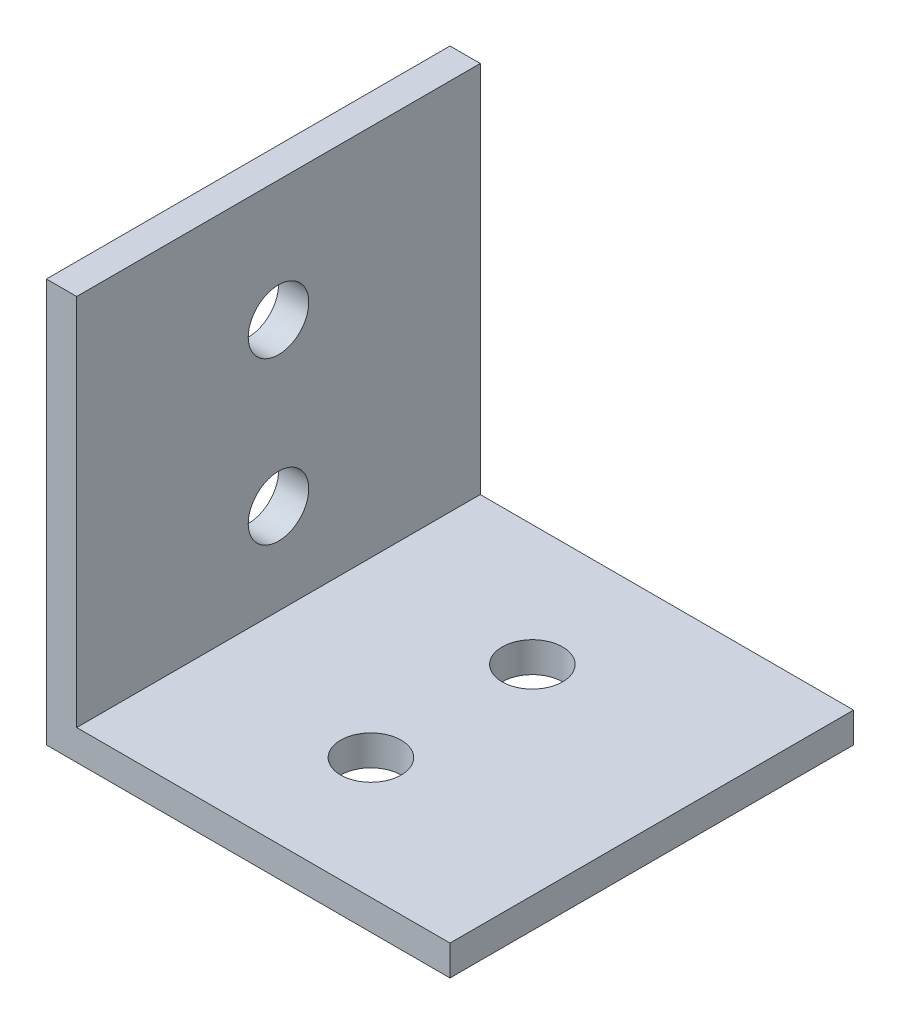
ISO-10303-21;
HEADER;
FILE_DESCRIPTION(('STEP AP214'),'2;1');
FILE_NAME('part.step','',(''),(''),'','','');
FILE_SCHEMA(('AUTOMOTIVE_DESIGN { 1 0 10303 214 1 1 1 1 }'));
ENDSEC;
DATA;
#1=APPLICATION_CONTEXT('core data for automotive mechanical design processes');
#2=APPLICATION_PROTOCOL_DEFINITION('international standard','automotive_design',2000,#1);
#3=PRODUCT_CONTEXT('',#1,'mechanical');
#4=PRODUCT('Part','Part','',(#3));
#5=PRODUCT_RELATED_PRODUCT_CATEGORY('part','',(#4));
#6=PRODUCT_DEFINITION_FORMATION('','',#4);
#7=PRODUCT_DEFINITION_CONTEXT('part definition',#1,'design');
#8=PRODUCT_DEFINITION('design','',#6,#7);
#9=PRODUCT_DEFINITION_SHAPE('','',#8);
#10=(LENGTH_UNIT() NAMED_UNIT(*) SI_UNIT(.MILLI.,.METRE.));
#11=(NAMED_UNIT(*) PLANE_ANGLE_UNIT() SI_UNIT($,.RADIAN.));
#12=(NAMED_UNIT(*) SI_UNIT($,.STERADIAN.) SOLID_ANGLE_UNIT());
#13=UNCERTAINTY_MEASURE_WITH_UNIT(LENGTH_MEASURE(1.E-05),#10,'distance_accuracy_value','');
#14=(GEOMETRIC_REPRESENTATION_CONTEXT(3) GLOBAL_UNCERTAINTY_ASSIGNED_CONTEXT((#13)) GLOBAL_UNIT_ASSIGNED_CONTEXT((#10,
#11,#12)) REPRESENTATION_CONTEXT('',''));
#15=CARTESIAN_POINT('',(0.,0.,0.));
#16=DIRECTION('',(0.,0.,1.));
#17=DIRECTION('',(1.,0.,0.));
#18=AXIS2_PLACEMENT_3D('',#15,#16,#17);
#19=CARTESIAN_POINT('',(-17.2142713590001,3.49808917197452,20.));
#20=DIRECTION('',(0.,-1.,0.));
#21=DIRECTION('',(1.,0.,0.));
#22=AXIS2_PLACEMENT_3D('',#19,#20,#21);
#23=PLANE('',#22);
#24=DIRECTION('',(-1.,0.,0.));
#25=VECTOR('',#24,1.);
#26=CARTESIAN_POINT('',(-17.2142713590001,3.49808917197452,0.));
#27=LINE('',#26,#25);
#28=CARTESIAN_POINT('',(-17.2142713590001,3.49808917197452,0.));
#29=VERTEX_POINT('',#28);
#30=CARTESIAN_POINT('',(-18.7142713590001,3.49808917197452,0.));
#31=VERTEX_POINT('',#30);
#32=EDGE_CURVE('E117',#29,#31,#27,.T.);
#33=ORIENTED_EDGE('',*,*,#32,.T.);
#34=DIRECTION('',(0.,0.,-1.));
#35=VECTOR('',#34,1.);
#36=CARTESIAN_POINT('',(-18.7142713590001,3.49808917197452,20.));
#37=LINE('',#36,#35);
#38=CARTESIAN_POINT('',(-18.7142713590001,3.49808917197452,20.));
#39=VERTEX_POINT('',#38);
#40=EDGE_CURVE('E11',#39,#31,#37,.T.);
#41=ORIENTED_EDGE('',*,*,#40,.F.);
#42=DIRECTION('',(-1.,0.,0.));
#43=VECTOR('',#42,1.);
#44=CARTESIAN_POINT('',(-17.2142713590001,3.49808917197452,20.));
#45=LINE('',#44,#43);
#46=CARTESIAN_POINT('',(-17.2142713590001,3.49808917197452,20.));
#47=VERTEX_POINT('',#46);
#48=EDGE_CURVE('E128',#47,#39,#45,.T.);
#49=ORIENTED_EDGE('',*,*,#48,.F.);
#50=DIRECTION('',(0.,0.,-1.));
#51=VECTOR('',#50,1.);
#52=CARTESIAN_POINT('',(-17.2142713590001,3.49808917197452,20.));
#53=LINE('',#52,#51);
#54=EDGE_CURVE('E113',#47,#29,#53,.T.);
#55=ORIENTED_EDGE('',*,*,#54,.T.);
#56=EDGE_LOOP('',(#33,#41,#49,#55));
#57=FACE_BOUND('',#56,.T.);
#58=ADVANCED_FACE('F31',(#57),#23,.F.);
#59=CARTESIAN_POINT('',(-18.7142713590001,3.49808917197452,20.));
#60=DIRECTION('',(1.,0.,0.));
#61=DIRECTION('',(0.,1.,0.));
#62=AXIS2_PLACEMENT_3D('',#59,#60,#61);
#63=PLANE('',#62);
#64=CARTESIAN_POINT('',(-18.7142713590001,-2.50191082802548,10.));
#65=DIRECTION('',(-1.,0.,0.));
#66=DIRECTION('',(0.,-1.,0.));
#67=AXIS2_PLACEMENT_3D('',#64,#65,#66);
#68=CIRCLE('',#67,1.5);
#69=CARTESIAN_POINT('',(-18.7142713590001,-4.00191082802548,10.));
#70=VERTEX_POINT('',#69);
#71=EDGE_CURVE('E147',#70,#70,#68,.T.);
#72=ORIENTED_EDGE('',*,*,#71,.F.);
#73=EDGE_LOOP('',(#72));
#74=FACE_BOUND('',#73,.T.);
#75=CARTESIAN_POINT('',(-18.7142713590001,-10.5019108280255,10.));
#76=DIRECTION('',(-1.,0.,0.));
#77=DIRECTION('',(0.,-1.,0.));
#78=AXIS2_PLACEMENT_3D('',#75,#76,#77);
#79=CIRCLE('',#78,1.5);
#80=CARTESIAN_POINT('',(-18.7142713590001,-12.0019108280255,10.));
#81=VERTEX_POINT('',#80);
#82=EDGE_CURVE('E136',#81,#81,#79,.T.);
#83=ORIENTED_EDGE('',*,*,#82,.F.);
#84=EDGE_LOOP('',(#83));
#85=FACE_BOUND('',#84,.T.);
#86=DIRECTION('',(0.,-1.,0.));
#87=VECTOR('',#86,1.);
#88=CARTESIAN_POINT('',(-18.7142713590001,3.49808917197452,0.));
#89=LINE('',#88,#87);
#90=CARTESIAN_POINT('',(-18.7142713590001,-16.5019108280255,0.));
#91=VERTEX_POINT('',#90);
#92=EDGE_CURVE('E120',#31,#91,#89,.T.);
#93=ORIENTED_EDGE('',*,*,#92,.T.);
#94=DIRECTION('',(0.,0.,-1.));
#95=VECTOR('',#94,1.);
#96=CARTESIAN_POINT('',(-18.7142713590001,-16.5019108280255,20.));
#97=LINE('',#96,#95);
#98=CARTESIAN_POINT('',(-18.7142713590001,-16.5019108280255,20.));
#99=VERTEX_POINT('',#98);
#100=EDGE_CURVE('E40',#99,#91,#97,.T.);
#101=ORIENTED_EDGE('',*,*,#100,.F.);
#102=DIRECTION('',(0.,-1.,0.));
#103=VECTOR('',#102,1.);
#104=CARTESIAN_POINT('',(-18.7142713590001,3.49808917197452,20.));
#105=LINE('',#104,#103);
#106=EDGE_CURVE('E86',#39,#99,#105,.T.);
#107=ORIENTED_EDGE('',*,*,#106,.F.);
#108=ORIENTED_EDGE('',*,*,#40,.T.);
#109=EDGE_LOOP('',(#93,#101,#107,#108));
#110=FACE_BOUND('',#109,.T.);
#111=ADVANCED_FACE('F160',(#74,#85,#110),#63,.F.);
#112=CARTESIAN_POINT('',(-18.7142713590001,-16.5019108280255,20.));
#113=DIRECTION('',(0.,1.,0.));
#114=DIRECTION('',(0.,0.,1.));
#115=AXIS2_PLACEMENT_3D('',#112,#113,#114);
#116=PLANE('',#115);
#117=CARTESIAN_POINT('',(-8.6336527340336,-16.5019108280255,6.));
#118=DIRECTION('',(0.,1.,0.));
#119=DIRECTION('',(0.,0.,1.));
#120=AXIS2_PLACEMENT_3D('',#117,#118,#119);
#121=CIRCLE('',#120,1.5);
#122=CARTESIAN_POINT('',(-8.6336527340336,-16.5019108280255,7.5));
#123=VERTEX_POINT('',#122);
#124=EDGE_CURVE('E140',#123,#123,#121,.T.);
#125=ORIENTED_EDGE('',*,*,#124,.T.);
#126=EDGE_LOOP('',(#125));
#127=FACE_BOUND('',#126,.T.);
#128=CARTESIAN_POINT('',(-8.6336527340336,-16.5019108280255,14.));
#129=DIRECTION('',(0.,1.,0.));
#130=DIRECTION('',(0.,0.,1.));
#131=AXIS2_PLACEMENT_3D('',#128,#129,#130);
#132=CIRCLE('',#131,1.5);
#133=CARTESIAN_POINT('',(-8.6336527340336,-16.5019108280255,15.5));
#134=VERTEX_POINT('',#133);
#135=EDGE_CURVE('E121',#134,#134,#132,.T.);
#136=ORIENTED_EDGE('',*,*,#135,.T.);
#137=EDGE_LOOP('',(#136));
#138=FACE_BOUND('',#137,.T.);
#139=DIRECTION('',(1.,0.,0.));
#140=VECTOR('',#139,1.);
#141=CARTESIAN_POINT('',(-18.7142713590001,-16.5019108280255,0.));
#142=LINE('',#141,#140);
#143=CARTESIAN_POINT('',(1.28572864099994,-16.5019108280255,0.));
#144=VERTEX_POINT('',#143);
#145=EDGE_CURVE('E123',#91,#144,#142,.T.);
#146=ORIENTED_EDGE('',*,*,#145,.T.);
#147=DIRECTION('',(0.,0.,-1.));
#148=VECTOR('',#147,1.);
#149=CARTESIAN_POINT('',(1.28572864099994,-16.5019108280255,20.));
#150=LINE('',#149,#148);
#151=CARTESIAN_POINT('',(1.28572864099994,-16.5019108280255,20.));
#152=VERTEX_POINT('',#151);
#153=EDGE_CURVE('E108',#152,#144,#150,.T.);
#154=ORIENTED_EDGE('',*,*,#153,.F.);
#155=DIRECTION('',(1.,0.,0.));
#156=VECTOR('',#155,1.);
#157=CARTESIAN_POINT('',(-18.7142713590001,-16.5019108280255,20.));
#158=LINE('',#157,#156);
#159=EDGE_CURVE('E99',#99,#152,#158,.T.);
#160=ORIENTED_EDGE('',*,*,#159,.F.);
#161=ORIENTED_EDGE('',*,*,#100,.T.);
#162=EDGE_LOOP('',(#146,#154,#160,#161));
#163=FACE_BOUND('',#162,.T.);
#164=ADVANCED_FACE('F163',(#127,#138,#163),#116,.F.);
#165=CARTESIAN_POINT('',(1.28572864099994,-16.5019108280255,20.));
#166=DIRECTION('',(-1.,0.,0.));
#167=DIRECTION('',(0.,0.,1.));
#168=AXIS2_PLACEMENT_3D('',#165,#166,#167);
#169=PLANE('',#168);
#170=DIRECTION('',(0.,1.,0.));
#171=VECTOR('',#170,1.);
#172=CARTESIAN_POINT('',(1.28572864099994,-16.5019108280255,0.));
#173=LINE('',#172,#171);
#174=CARTESIAN_POINT('',(1.28572864099994,-15.0019108280255,0.));
#175=VERTEX_POINT('',#174);
#176=EDGE_CURVE('E107',#144,#175,#173,.T.);
#177=ORIENTED_EDGE('',*,*,#176,.T.);
#178=DIRECTION('',(0.,0.,-1.));
#179=VECTOR('',#178,1.);
#180=CARTESIAN_POINT('',(1.28572864099994,-15.0019108280255,20.));
#181=LINE('',#180,#179);
#182=CARTESIAN_POINT('',(1.28572864099994,-15.0019108280255,20.));
#183=VERTEX_POINT('',#182);
#184=EDGE_CURVE('E104',#183,#175,#181,.T.);
#185=ORIENTED_EDGE('',*,*,#184,.F.);
#186=DIRECTION('',(0.,1.,0.));
#187=VECTOR('',#186,1.);
#188=CARTESIAN_POINT('',(1.28572864099994,-16.5019108280255,20.));
#189=LINE('',#188,#187);
#190=EDGE_CURVE('E93',#152,#183,#189,.T.);
#191=ORIENTED_EDGE('',*,*,#190,.F.);
#192=ORIENTED_EDGE('',*,*,#153,.T.);
#193=EDGE_LOOP('',(#177,#185,#191,#192));
#194=FACE_BOUND('',#193,.T.);
#195=ADVANCED_FACE('F105',(#194),#169,.F.);
#196=CARTESIAN_POINT('',(1.28572864099994,-15.0019108280255,20.));
#197=DIRECTION('',(0.,-1.,0.));
#198=DIRECTION('',(1.,0.,0.));
#199=AXIS2_PLACEMENT_3D('',#196,#197,#198);
#200=PLANE('',#199);
#201=CARTESIAN_POINT('',(-8.6336527340336,-15.0019108280255,6.));
#202=DIRECTION('',(0.,1.,0.));
#203=DIRECTION('',(-1.,0.,0.));
#204=AXIS2_PLACEMENT_3D('',#201,#202,#203);
#205=CIRCLE('',#204,1.5);
#206=CARTESIAN_POINT('',(-10.1336527340336,-15.0019108280255,6.));
#207=VERTEX_POINT('',#206);
#208=EDGE_CURVE('E135',#207,#207,#205,.T.);
#209=ORIENTED_EDGE('',*,*,#208,.F.);
#210=EDGE_LOOP('',(#209));
#211=FACE_BOUND('',#210,.T.);
#212=CARTESIAN_POINT('',(-8.6336527340336,-15.0019108280255,14.));
#213=DIRECTION('',(0.,1.,0.));
#214=DIRECTION('',(-1.,0.,0.));
#215=AXIS2_PLACEMENT_3D('',#212,#213,#214);
#216=CIRCLE('',#215,1.5);
#217=CARTESIAN_POINT('',(-10.1336527340336,-15.0019108280255,14.));
#218=VERTEX_POINT('',#217);
#219=EDGE_CURVE('E152',#218,#218,#216,.T.);
#220=ORIENTED_EDGE('',*,*,#219,.F.);
#221=EDGE_LOOP('',(#220));
#222=FACE_BOUND('',#221,.T.);
#223=DIRECTION('',(-1.,0.,0.));
#224=VECTOR('',#223,1.);
#225=CARTESIAN_POINT('',(1.28572864099994,-15.0019108280255,0.));
#226=LINE('',#225,#224);
#227=CARTESIAN_POINT('',(-17.2142713590001,-15.0019108280255,0.));
#228=VERTEX_POINT('',#227);
#229=EDGE_CURVE('E72',#175,#228,#226,.T.);
#230=ORIENTED_EDGE('',*,*,#229,.T.);
#231=DIRECTION('',(0.,0.,-1.));
#232=VECTOR('',#231,1.);
#233=CARTESIAN_POINT('',(-17.2142713590001,-15.0019108280255,20.));
#234=LINE('',#233,#232);
#235=CARTESIAN_POINT('',(-17.2142713590001,-15.0019108280255,20.));
#236=VERTEX_POINT('',#235);
#237=EDGE_CURVE('E109',#236,#228,#234,.T.);
#238=ORIENTED_EDGE('',*,*,#237,.F.);
#239=DIRECTION('',(-1.,0.,0.));
#240=VECTOR('',#239,1.);
#241=CARTESIAN_POINT('',(1.28572864099994,-15.0019108280255,20.));
#242=LINE('',#241,#240);
#243=EDGE_CURVE('E97',#183,#236,#242,.T.);
#244=ORIENTED_EDGE('',*,*,#243,.F.);
#245=ORIENTED_EDGE('',*,*,#184,.T.);
#246=EDGE_LOOP('',(#230,#238,#244,#245));
#247=FACE_BOUND('',#246,.T.);
#248=ADVANCED_FACE('F111',(#211,#222,#247),#200,.F.);
#249=CARTESIAN_POINT('',(-17.2142713590001,-15.0019108280255,20.));
#250=DIRECTION('',(-1.,0.,0.));
#251=DIRECTION('',(0.,0.,1.));
#252=AXIS2_PLACEMENT_3D('',#249,#250,#251);
#253=PLANE('',#252);
#254=CARTESIAN_POINT('',(-17.2142713590001,-2.50191082802547,10.));
#255=DIRECTION('',(-1.,0.,0.));
#256=DIRECTION('',(0.,0.,1.));
#257=AXIS2_PLACEMENT_3D('',#254,#255,#256);
#258=CIRCLE('',#257,1.5);
#259=CARTESIAN_POINT('',(-17.2142713590001,-2.50191082802547,11.5));
#260=VERTEX_POINT('',#259);
#261=EDGE_CURVE('E34',#260,#260,#258,.T.);
#262=ORIENTED_EDGE('',*,*,#261,.T.);
#263=EDGE_LOOP('',(#262));
#264=FACE_BOUND('',#263,.T.);
#265=CARTESIAN_POINT('',(-17.2142713590001,-10.5019108280255,10.));
#266=DIRECTION('',(-1.,0.,0.));
#267=DIRECTION('',(0.,0.,1.));
#268=AXIS2_PLACEMENT_3D('',#265,#266,#267);
#269=CIRCLE('',#268,1.5);
#270=CARTESIAN_POINT('',(-17.2142713590001,-10.5019108280255,11.5));
#271=VERTEX_POINT('',#270);
#272=EDGE_CURVE('E133',#271,#271,#269,.T.);
#273=ORIENTED_EDGE('',*,*,#272,.T.);
#274=EDGE_LOOP('',(#273));
#275=FACE_BOUND('',#274,.T.);
#276=DIRECTION('',(0.,1.,0.));
#277=VECTOR('',#276,1.);
#278=CARTESIAN_POINT('',(-17.2142713590001,-15.0019108280255,0.));
#279=LINE('',#278,#277);
#280=EDGE_CURVE('E78',#228,#29,#279,.T.);
#281=ORIENTED_EDGE('',*,*,#280,.T.);
#282=ORIENTED_EDGE('',*,*,#54,.F.);
#283=DIRECTION('',(0.,1.,0.));
#284=VECTOR('',#283,1.);
#285=CARTESIAN_POINT('',(-17.2142713590001,-15.0019108280255,20.));
#286=LINE('',#285,#284);
#287=EDGE_CURVE('E49',#236,#47,#286,.T.);
#288=ORIENTED_EDGE('',*,*,#287,.F.);
#289=ORIENTED_EDGE('',*,*,#237,.T.);
#290=EDGE_LOOP('',(#281,#282,#288,#289));
#291=FACE_BOUND('',#290,.T.);
#292=ADVANCED_FACE('F168',(#264,#275,#291),#253,.F.);
#293=CARTESIAN_POINT('',(-18.7142713590001,3.49808917197452,20.));
#294=DIRECTION('',(0.,0.,1.));
#295=DIRECTION('',(1.,0.,0.));
#296=AXIS2_PLACEMENT_3D('',#293,#294,#295);
#297=PLANE('',#296);
#298=ORIENTED_EDGE('',*,*,#48,.T.);
#299=ORIENTED_EDGE('',*,*,#106,.T.);
#300=ORIENTED_EDGE('',*,*,#159,.T.);
#301=ORIENTED_EDGE('',*,*,#190,.T.);
#302=ORIENTED_EDGE('',*,*,#243,.T.);
#303=ORIENTED_EDGE('',*,*,#287,.T.);
#304=EDGE_LOOP('',(#298,#299,#300,#301,#302,#303));
#305=FACE_BOUND('',#304,.T.);
#306=ADVANCED_FACE('F95',(#305),#297,.T.);
#307=CARTESIAN_POINT('',(-18.7142713590001,3.49808917197452,0.));
#308=DIRECTION('',(0.,0.,1.));
#309=DIRECTION('',(1.,0.,0.));
#310=AXIS2_PLACEMENT_3D('',#307,#308,#309);
#311=PLANE('',#310);
#312=ORIENTED_EDGE('',*,*,#32,.F.);
#313=ORIENTED_EDGE('',*,*,#280,.F.);
#314=ORIENTED_EDGE('',*,*,#229,.F.);
#315=ORIENTED_EDGE('',*,*,#176,.F.);
#316=ORIENTED_EDGE('',*,*,#145,.F.);
#317=ORIENTED_EDGE('',*,*,#92,.F.);
#318=EDGE_LOOP('',(#312,#313,#314,#315,#316,#317));
#319=FACE_BOUND('',#318,.T.);
#320=ADVANCED_FACE('F166',(#319),#311,.F.);
#321=CARTESIAN_POINT('',(-8.6336527340336,-35.0019108280255,14.));
#322=DIRECTION('',(0.,1.,0.));
#323=DIRECTION('',(-1.,0.,0.));
#324=AXIS2_PLACEMENT_3D('',#321,#322,#323);
#325=CYLINDRICAL_SURFACE('',#324,1.5);
#326=ORIENTED_EDGE('',*,*,#219,.T.);
#327=EDGE_LOOP('',(#326));
#328=FACE_BOUND('',#327,.T.);
#329=ORIENTED_EDGE('',*,*,#135,.F.);
#330=EDGE_LOOP('',(#329));
#331=FACE_BOUND('',#330,.T.);
#332=ADVANCED_FACE('F219',(#328,#331),#325,.F.);
#333=CARTESIAN_POINT('',(-8.6336527340336,-35.0019108280255,6.));
#334=DIRECTION('',(0.,1.,0.));
#335=DIRECTION('',(-1.,0.,0.));
#336=AXIS2_PLACEMENT_3D('',#333,#334,#335);
#337=CYLINDRICAL_SURFACE('',#336,1.5);
#338=ORIENTED_EDGE('',*,*,#208,.T.);
#339=EDGE_LOOP('',(#338));
#340=FACE_BOUND('',#339,.T.);
#341=ORIENTED_EDGE('',*,*,#124,.F.);
#342=EDGE_LOOP('',(#341));
#343=FACE_BOUND('',#342,.T.);
#344=ADVANCED_FACE('F224',(#340,#343),#337,.F.);
#345=CARTESIAN_POINT('',(-8.71427135900006,-10.5019108280255,10.));
#346=DIRECTION('',(-1.,0.,0.));
#347=DIRECTION('',(0.,-1.,0.));
#348=AXIS2_PLACEMENT_3D('',#345,#346,#347);
#349=CYLINDRICAL_SURFACE('',#348,1.5);
#350=ORIENTED_EDGE('',*,*,#82,.T.);
#351=EDGE_LOOP('',(#350));
#352=FACE_BOUND('',#351,.T.);
#353=ORIENTED_EDGE('',*,*,#272,.F.);
#354=EDGE_LOOP('',(#353));
#355=FACE_BOUND('',#354,.T.);
#356=ADVANCED_FACE('F231',(#352,#355),#349,.F.);
#357=CARTESIAN_POINT('',(-8.71427135900006,-2.50191082802547,10.));
#358=DIRECTION('',(-1.,0.,0.));
#359=DIRECTION('',(0.,-1.,0.));
#360=AXIS2_PLACEMENT_3D('',#357,#358,#359);
#361=CYLINDRICAL_SURFACE('',#360,1.5);
#362=ORIENTED_EDGE('',*,*,#71,.T.);
#363=EDGE_LOOP('',(#362));
#364=FACE_BOUND('',#363,.T.);
#365=ORIENTED_EDGE('',*,*,#261,.F.);
#366=EDGE_LOOP('',(#365));
#367=FACE_BOUND('',#366,.T.);
#368=ADVANCED_FACE('F238',(#364,#367),#361,.F.);
#369=CLOSED_SHELL('',(#58,#111,#164,#195,#248,#292,#306,#320,#332,#344,#356,#368));
#370=MANIFOLD_SOLID_BREP('B2',#369);
#371=ADVANCED_BREP_SHAPE_REPRESENTATION('',(#18,#370),#14);
#372=SHAPE_DEFINITION_REPRESENTATION(#9,#371);
ENDSEC;
END-ISO-10303-21;
